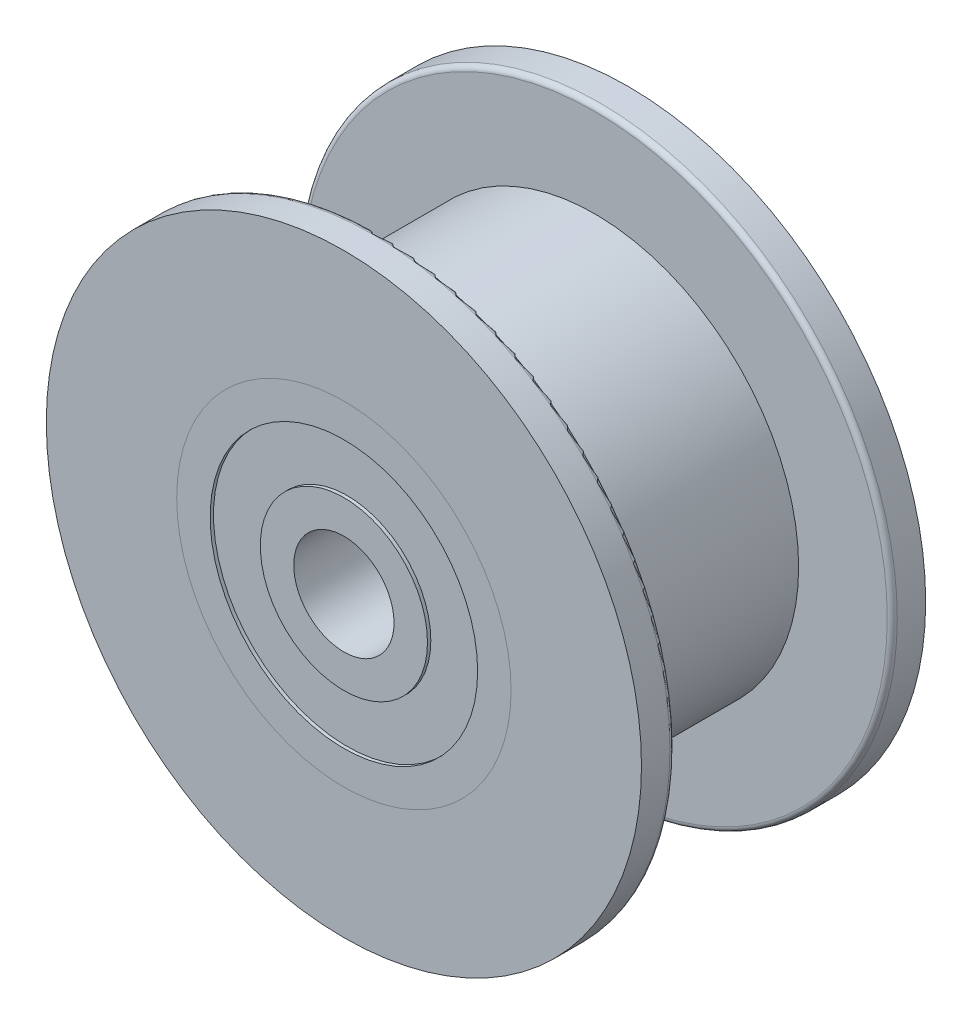
ISO-10303-21;
HEADER;
FILE_DESCRIPTION(('STEP AP214'),'2;1');
FILE_NAME('part.step','',(''),(''),'','','');
FILE_SCHEMA(('AUTOMOTIVE_DESIGN { 1 0 10303 214 1 1 1 1 }'));
ENDSEC;
DATA;
#1=APPLICATION_CONTEXT('core data for automotive mechanical design processes');
#2=APPLICATION_PROTOCOL_DEFINITION('international standard','automotive_design',2000,#1);
#3=PRODUCT_CONTEXT('',#1,'mechanical');
#4=PRODUCT('Part','Part','',(#3));
#5=PRODUCT_RELATED_PRODUCT_CATEGORY('part','',(#4));
#6=PRODUCT_DEFINITION_FORMATION('','',#4);
#7=PRODUCT_DEFINITION_CONTEXT('part definition',#1,'design');
#8=PRODUCT_DEFINITION('design','',#6,#7);
#9=PRODUCT_DEFINITION_SHAPE('','',#8);
#10=(LENGTH_UNIT() NAMED_UNIT(*) SI_UNIT(.MILLI.,.METRE.));
#11=(NAMED_UNIT(*) PLANE_ANGLE_UNIT() SI_UNIT($,.RADIAN.));
#12=(NAMED_UNIT(*) SI_UNIT($,.STERADIAN.) SOLID_ANGLE_UNIT());
#13=UNCERTAINTY_MEASURE_WITH_UNIT(LENGTH_MEASURE(1.E-05),#10,'distance_accuracy_value','');
#14=(GEOMETRIC_REPRESENTATION_CONTEXT(3) GLOBAL_UNCERTAINTY_ASSIGNED_CONTEXT((#13)) GLOBAL_UNIT_ASSIGNED_CONTEXT((#10,
#11,#12)) REPRESENTATION_CONTEXT('',''));
#15=CARTESIAN_POINT('',(0.,0.,0.));
#16=DIRECTION('',(0.,0.,1.));
#17=DIRECTION('',(1.,0.,0.));
#18=AXIS2_PLACEMENT_3D('',#15,#16,#17);
#19=CARTESIAN_POINT('',(0.,0.,4.2));
#20=DIRECTION('',(0.,0.,1.));
#21=DIRECTION('',(1.,0.,0.));
#22=AXIS2_PLACEMENT_3D('',#19,#20,#21);
#23=PLANE('',#22);
#24=CARTESIAN_POINT('',(0.,0.,4.2));
#25=DIRECTION('',(0.,0.,1.));
#26=DIRECTION('',(1.,0.,0.));
#27=AXIS2_PLACEMENT_3D('',#24,#25,#26);
#28=CIRCLE('',#27,2.5);
#29=CARTESIAN_POINT('',(2.5,0.,4.2));
#30=VERTEX_POINT('',#29);
#31=EDGE_CURVE('P0_E27',#30,#30,#28,.T.);
#32=ORIENTED_EDGE('',*,*,#31,.T.);
#33=EDGE_LOOP('',(#32));
#34=FACE_BOUND('',#33,.T.);
#35=CARTESIAN_POINT('',(0.,0.,4.2));
#36=DIRECTION('',(0.,0.,1.));
#37=DIRECTION('',(1.,0.,0.));
#38=AXIS2_PLACEMENT_3D('',#35,#36,#37);
#39=CIRCLE('',#38,4.);
#40=CARTESIAN_POINT('',(4.,0.,4.2));
#41=VERTEX_POINT('',#40);
#42=EDGE_CURVE('P0_E18',#41,#41,#39,.T.);
#43=ORIENTED_EDGE('',*,*,#42,.F.);
#44=EDGE_LOOP('',(#43));
#45=FACE_BOUND('',#44,.T.);
#46=ADVANCED_FACE('P0_F15',(#34,#45),#23,.F.);
#47=CARTESIAN_POINT('',(0.,0.,4.2));
#48=DIRECTION('',(0.,0.,1.));
#49=DIRECTION('',(1.,0.,0.));
#50=AXIS2_PLACEMENT_3D('',#47,#48,#49);
#51=CYLINDRICAL_SURFACE('',#50,4.);
#52=ORIENTED_EDGE('',*,*,#42,.T.);
#53=EDGE_LOOP('',(#52));
#54=FACE_BOUND('',#53,.T.);
#55=CARTESIAN_POINT('',(0.,0.,4.4));
#56=DIRECTION('',(0.,0.,1.));
#57=DIRECTION('',(1.,0.,0.));
#58=AXIS2_PLACEMENT_3D('',#55,#56,#57);
#59=CIRCLE('',#58,4.);
#60=CARTESIAN_POINT('',(4.,0.,4.4));
#61=VERTEX_POINT('',#60);
#62=EDGE_CURVE('P0_E22',#61,#61,#59,.T.);
#63=ORIENTED_EDGE('',*,*,#62,.F.);
#64=EDGE_LOOP('',(#63));
#65=FACE_BOUND('',#64,.T.);
#66=ADVANCED_FACE('P0_F35',(#54,#65),#51,.T.);
#67=CARTESIAN_POINT('',(0.,0.,4.2));
#68=DIRECTION('',(0.,0.,1.));
#69=DIRECTION('',(1.,0.,0.));
#70=AXIS2_PLACEMENT_3D('',#67,#68,#69);
#71=CYLINDRICAL_SURFACE('',#70,2.5);
#72=ORIENTED_EDGE('',*,*,#31,.F.);
#73=EDGE_LOOP('',(#72));
#74=FACE_BOUND('',#73,.T.);
#75=CARTESIAN_POINT('',(0.,0.,4.4));
#76=DIRECTION('',(0.,0.,1.));
#77=DIRECTION('',(1.,0.,0.));
#78=AXIS2_PLACEMENT_3D('',#75,#76,#77);
#79=CIRCLE('',#78,2.5);
#80=CARTESIAN_POINT('',(2.5,0.,4.4));
#81=VERTEX_POINT('',#80);
#82=EDGE_CURVE('P0_E10',#81,#81,#79,.F.);
#83=ORIENTED_EDGE('',*,*,#82,.F.);
#84=EDGE_LOOP('',(#83));
#85=FACE_BOUND('',#84,.T.);
#86=ADVANCED_FACE('P0_F43',(#74,#85),#71,.F.);
#87=CARTESIAN_POINT('',(0.,0.,4.4));
#88=DIRECTION('',(0.,0.,1.));
#89=DIRECTION('',(1.,0.,0.));
#90=AXIS2_PLACEMENT_3D('',#87,#88,#89);
#91=PLANE('',#90);
#92=ORIENTED_EDGE('',*,*,#82,.T.);
#93=EDGE_LOOP('',(#92));
#94=FACE_BOUND('',#93,.T.);
#95=ORIENTED_EDGE('',*,*,#62,.T.);
#96=EDGE_LOOP('',(#95));
#97=FACE_BOUND('',#96,.T.);
#98=ADVANCED_FACE('P0_F44',(#94,#97),#91,.T.);
#99=CLOSED_SHELL('',(#46,#66,#86,#98));
#100=MANIFOLD_SOLID_BREP('P0_B1',#99);
#101=CARTESIAN_POINT('',(0.,0.,0.25));
#102=DIRECTION('',(0.,0.,1.));
#103=DIRECTION('',(1.,0.,0.));
#104=AXIS2_PLACEMENT_3D('',#101,#102,#103);
#105=CYLINDRICAL_SURFACE('',#104,6.1);
#106=CARTESIAN_POINT('',(0.,0.,-3.));
#107=DIRECTION('',(0.,0.,1.));
#108=DIRECTION('',(1.,0.,0.));
#109=AXIS2_PLACEMENT_3D('',#106,#107,#108);
#110=CIRCLE('',#109,6.1);
#111=CARTESIAN_POINT('',(6.1,0.,-3.));
#112=VERTEX_POINT('',#111);
#113=EDGE_CURVE('P1_E18',#112,#112,#110,.F.);
#114=ORIENTED_EDGE('',*,*,#113,.F.);
#115=EDGE_LOOP('',(#114));
#116=FACE_BOUND('',#115,.T.);
#117=CARTESIAN_POINT('',(0.,0.,3.5));
#118=DIRECTION('',(0.,0.,1.));
#119=DIRECTION('',(1.,0.,0.));
#120=AXIS2_PLACEMENT_3D('',#117,#118,#119);
#121=CIRCLE('',#120,6.1);
#122=CARTESIAN_POINT('',(6.1,0.,3.5));
#123=VERTEX_POINT('',#122);
#124=EDGE_CURVE('P1_E40',#123,#123,#121,.T.);
#125=ORIENTED_EDGE('',*,*,#124,.F.);
#126=EDGE_LOOP('',(#125));
#127=FACE_BOUND('',#126,.T.);
#128=ADVANCED_FACE('P1_F15',(#116,#127),#105,.T.);
#129=CARTESIAN_POINT('',(0.,0.,-3.));
#130=DIRECTION('',(0.,0.,1.));
#131=DIRECTION('',(1.,0.,0.));
#132=AXIS2_PLACEMENT_3D('',#129,#130,#131);
#133=PLANE('',#132);
#134=ORIENTED_EDGE('',*,*,#113,.T.);
#135=EDGE_LOOP('',(#134));
#136=FACE_BOUND('',#135,.T.);
#137=CARTESIAN_POINT('',(0.,0.,-3.));
#138=DIRECTION('',(0.,0.,-1.));
#139=DIRECTION('',(-1.,0.,0.));
#140=AXIS2_PLACEMENT_3D('',#137,#138,#139);
#141=CIRCLE('',#140,8.75);
#142=CARTESIAN_POINT('',(-8.75,0.,-3.));
#143=VERTEX_POINT('',#142);
#144=EDGE_CURVE('P1_E42',#143,#143,#141,.T.);
#145=ORIENTED_EDGE('',*,*,#144,.F.);
#146=EDGE_LOOP('',(#145));
#147=FACE_BOUND('',#146,.T.);
#148=ADVANCED_FACE('P1_F50',(#136,#147),#133,.T.);
#149=CARTESIAN_POINT('',(0.,0.,3.5));
#150=DIRECTION('',(0.,0.,-1.));
#151=DIRECTION('',(-1.,0.,0.));
#152=AXIS2_PLACEMENT_3D('',#149,#150,#151);
#153=PLANE('',#152);
#154=ORIENTED_EDGE('',*,*,#124,.T.);
#155=EDGE_LOOP('',(#154));
#156=FACE_BOUND('',#155,.T.);
#157=CARTESIAN_POINT('',(0.,0.,3.5));
#158=DIRECTION('',(0.,0.,1.));
#159=DIRECTION('',(1.,0.,0.));
#160=AXIS2_PLACEMENT_3D('',#157,#158,#159);
#161=CIRCLE('',#160,8.75);
#162=CARTESIAN_POINT('',(8.75,0.,3.5));
#163=VERTEX_POINT('',#162);
#164=EDGE_CURVE('P1_E46',#163,#163,#161,.T.);
#165=ORIENTED_EDGE('',*,*,#164,.F.);
#166=EDGE_LOOP('',(#165));
#167=FACE_BOUND('',#166,.T.);
#168=ADVANCED_FACE('P1_F59',(#156,#167),#153,.T.);
#169=CARTESIAN_POINT('',(0.,0.,-3.15));
#170=DIRECTION('',(0.,0.,1.));
#171=DIRECTION('',(1.,0.,0.));
#172=AXIS2_PLACEMENT_3D('',#169,#170,#171);
#173=TOROIDAL_SURFACE('',#172,8.75,0.15);
#174=CARTESIAN_POINT('',(0.,0.,-3.15));
#175=DIRECTION('',(0.,0.,1.));
#176=DIRECTION('',(1.,0.,0.));
#177=AXIS2_PLACEMENT_3D('',#174,#175,#176);
#178=CIRCLE('',#177,8.9);
#179=CARTESIAN_POINT('',(8.9,0.,-3.15));
#180=VERTEX_POINT('',#179);
#181=EDGE_CURVE('P1_E96',#180,#180,#178,.F.);
#182=ORIENTED_EDGE('',*,*,#181,.F.);
#183=EDGE_LOOP('',(#182));
#184=FACE_BOUND('',#183,.T.);
#185=ORIENTED_EDGE('',*,*,#144,.T.);
#186=EDGE_LOOP('',(#185));
#187=FACE_BOUND('',#186,.T.);
#188=ADVANCED_FACE('P1_F88',(#184,#187),#173,.T.);
#189=CARTESIAN_POINT('',(0.,0.,3.65));
#190=DIRECTION('',(0.,0.,-1.));
#191=DIRECTION('',(-1.,0.,0.));
#192=AXIS2_PLACEMENT_3D('',#189,#190,#191);
#193=TOROIDAL_SURFACE('',#192,8.75,0.15);
#194=CARTESIAN_POINT('',(0.,0.,3.65));
#195=DIRECTION('',(0.,0.,1.));
#196=DIRECTION('',(1.,0.,0.));
#197=AXIS2_PLACEMENT_3D('',#194,#195,#196);
#198=CIRCLE('',#197,8.9);
#199=CARTESIAN_POINT('',(8.9,0.,3.65));
#200=VERTEX_POINT('',#199);
#201=EDGE_CURVE('P1_E39',#200,#200,#198,.T.);
#202=ORIENTED_EDGE('',*,*,#201,.F.);
#203=EDGE_LOOP('',(#202));
#204=FACE_BOUND('',#203,.T.);
#205=ORIENTED_EDGE('',*,*,#164,.T.);
#206=EDGE_LOOP('',(#205));
#207=FACE_BOUND('',#206,.T.);
#208=ADVANCED_FACE('P1_F83',(#204,#207),#193,.T.);
#209=CARTESIAN_POINT('',(0.,0.,-3.5));
#210=DIRECTION('',(0.,0.,1.));
#211=DIRECTION('',(1.,0.,0.));
#212=AXIS2_PLACEMENT_3D('',#209,#210,#211);
#213=CYLINDRICAL_SURFACE('',#212,8.9);
#214=CARTESIAN_POINT('',(0.,0.,-4.));
#215=DIRECTION('',(0.,0.,1.));
#216=DIRECTION('',(1.,0.,0.));
#217=AXIS2_PLACEMENT_3D('',#214,#215,#216);
#218=CIRCLE('',#217,8.9);
#219=CARTESIAN_POINT('',(8.9,0.,-4.));
#220=VERTEX_POINT('',#219);
#221=EDGE_CURVE('P1_E37',#220,#220,#218,.F.);
#222=ORIENTED_EDGE('',*,*,#221,.F.);
#223=EDGE_LOOP('',(#222));
#224=FACE_BOUND('',#223,.T.);
#225=ORIENTED_EDGE('',*,*,#181,.T.);
#226=EDGE_LOOP('',(#225));
#227=FACE_BOUND('',#226,.T.);
#228=ADVANCED_FACE('P1_F79',(#224,#227),#213,.T.);
#229=CARTESIAN_POINT('',(0.,0.,4.));
#230=DIRECTION('',(0.,0.,1.));
#231=DIRECTION('',(1.,0.,0.));
#232=AXIS2_PLACEMENT_3D('',#229,#230,#231);
#233=CYLINDRICAL_SURFACE('',#232,8.9);
#234=ORIENTED_EDGE('',*,*,#201,.T.);
#235=EDGE_LOOP('',(#234));
#236=FACE_BOUND('',#235,.T.);
#237=CARTESIAN_POINT('',(0.,0.,4.5));
#238=DIRECTION('',(0.,0.,1.));
#239=DIRECTION('',(1.,0.,0.));
#240=AXIS2_PLACEMENT_3D('',#237,#238,#239);
#241=CIRCLE('',#240,8.9);
#242=CARTESIAN_POINT('',(8.9,0.,4.5));
#243=VERTEX_POINT('',#242);
#244=EDGE_CURVE('P1_E27',#243,#243,#241,.T.);
#245=ORIENTED_EDGE('',*,*,#244,.F.);
#246=EDGE_LOOP('',(#245));
#247=FACE_BOUND('',#246,.T.);
#248=ADVANCED_FACE('P1_F75',(#236,#247),#233,.T.);
#249=CARTESIAN_POINT('',(0.,0.,-4.));
#250=DIRECTION('',(0.,0.,-1.));
#251=DIRECTION('',(-1.,0.,0.));
#252=AXIS2_PLACEMENT_3D('',#249,#250,#251);
#253=PLANE('',#252);
#254=CARTESIAN_POINT('',(0.,0.,-4.));
#255=DIRECTION('',(0.,0.,-1.));
#256=DIRECTION('',(-1.,0.,0.));
#257=AXIS2_PLACEMENT_3D('',#254,#255,#256);
#258=CIRCLE('',#257,5.);
#259=CARTESIAN_POINT('',(-5.,0.,-4.));
#260=VERTEX_POINT('',#259);
#261=EDGE_CURVE('P1_E22',#260,#260,#258,.F.);
#262=ORIENTED_EDGE('',*,*,#261,.T.);
#263=EDGE_LOOP('',(#262));
#264=FACE_BOUND('',#263,.T.);
#265=ORIENTED_EDGE('',*,*,#221,.T.);
#266=EDGE_LOOP('',(#265));
#267=FACE_BOUND('',#266,.T.);
#268=ADVANCED_FACE('P1_F68',(#264,#267),#253,.T.);
#269=CARTESIAN_POINT('',(0.,0.,4.5));
#270=DIRECTION('',(0.,0.,1.));
#271=DIRECTION('',(1.,0.,0.));
#272=AXIS2_PLACEMENT_3D('',#269,#270,#271);
#273=PLANE('',#272);
#274=CARTESIAN_POINT('',(0.,0.,4.5));
#275=DIRECTION('',(0.,0.,-1.));
#276=DIRECTION('',(-1.,0.,0.));
#277=AXIS2_PLACEMENT_3D('',#274,#275,#276);
#278=CIRCLE('',#277,5.);
#279=CARTESIAN_POINT('',(-5.,0.,4.5));
#280=VERTEX_POINT('',#279);
#281=EDGE_CURVE('P1_E10',#280,#280,#278,.T.);
#282=ORIENTED_EDGE('',*,*,#281,.T.);
#283=EDGE_LOOP('',(#282));
#284=FACE_BOUND('',#283,.T.);
#285=ORIENTED_EDGE('',*,*,#244,.T.);
#286=EDGE_LOOP('',(#285));
#287=FACE_BOUND('',#286,.T.);
#288=ADVANCED_FACE('P1_F62',(#284,#287),#273,.T.);
#289=CARTESIAN_POINT('',(0.,0.,0.25));
#290=DIRECTION('',(0.,0.,-1.));
#291=DIRECTION('',(-1.,0.,0.));
#292=AXIS2_PLACEMENT_3D('',#289,#290,#291);
#293=CYLINDRICAL_SURFACE('',#292,5.);
#294=ORIENTED_EDGE('',*,*,#261,.F.);
#295=EDGE_LOOP('',(#294));
#296=FACE_BOUND('',#295,.T.);
#297=ORIENTED_EDGE('',*,*,#281,.F.);
#298=EDGE_LOOP('',(#297));
#299=FACE_BOUND('',#298,.T.);
#300=ADVANCED_FACE('P1_F60',(#296,#299),#293,.F.);
#301=CLOSED_SHELL('',(#128,#148,#168,#188,#208,#228,#248,#268,#288,#300));
#302=MANIFOLD_SOLID_BREP('P1_B1',#301);
#303=CARTESIAN_POINT('',(0.,0.,3.25));
#304=DIRECTION('',(0.,0.,1.));
#305=DIRECTION('',(1.,0.,0.));
#306=AXIS2_PLACEMENT_3D('',#303,#304,#305);
#307=CYLINDRICAL_SURFACE('',#306,4.);
#308=CARTESIAN_POINT('',(0.,0.,2.));
#309=DIRECTION('',(0.,0.,1.));
#310=DIRECTION('',(1.,0.,0.));
#311=AXIS2_PLACEMENT_3D('',#308,#309,#310);
#312=CIRCLE('',#311,4.);
#313=CARTESIAN_POINT('',(4.,0.,2.));
#314=VERTEX_POINT('',#313);
#315=EDGE_CURVE('P2_E27',#314,#314,#312,.T.);
#316=ORIENTED_EDGE('',*,*,#315,.F.);
#317=EDGE_LOOP('',(#316));
#318=FACE_BOUND('',#317,.T.);
#319=CARTESIAN_POINT('',(0.,0.,4.5));
#320=DIRECTION('',(0.,0.,1.));
#321=DIRECTION('',(1.,0.,0.));
#322=AXIS2_PLACEMENT_3D('',#319,#320,#321);
#323=CIRCLE('',#322,4.);
#324=CARTESIAN_POINT('',(4.,0.,4.5));
#325=VERTEX_POINT('',#324);
#326=EDGE_CURVE('P2_E18',#325,#325,#323,.F.);
#327=ORIENTED_EDGE('',*,*,#326,.F.);
#328=EDGE_LOOP('',(#327));
#329=FACE_BOUND('',#328,.T.);
#330=ADVANCED_FACE('P2_F15',(#318,#329),#307,.F.);
#331=CARTESIAN_POINT('',(4.,0.,4.5));
#332=DIRECTION('',(0.,0.,1.));
#333=DIRECTION('',(1.,0.,0.));
#334=AXIS2_PLACEMENT_3D('',#331,#332,#333);
#335=PLANE('',#334);
#336=ORIENTED_EDGE('',*,*,#326,.T.);
#337=EDGE_LOOP('',(#336));
#338=FACE_BOUND('',#337,.T.);
#339=CARTESIAN_POINT('',(0.,0.,4.5));
#340=DIRECTION('',(0.,0.,1.));
#341=DIRECTION('',(1.,0.,0.));
#342=AXIS2_PLACEMENT_3D('',#339,#340,#341);
#343=CIRCLE('',#342,5.);
#344=CARTESIAN_POINT('',(5.,0.,4.5));
#345=VERTEX_POINT('',#344);
#346=EDGE_CURVE('P2_E22',#345,#345,#343,.F.);
#347=ORIENTED_EDGE('',*,*,#346,.F.);
#348=EDGE_LOOP('',(#347));
#349=FACE_BOUND('',#348,.T.);
#350=ADVANCED_FACE('P2_F35',(#338,#349),#335,.T.);
#351=CARTESIAN_POINT('',(5.,0.,2.));
#352=DIRECTION('',(0.,0.,-1.));
#353=DIRECTION('',(-1.,0.,0.));
#354=AXIS2_PLACEMENT_3D('',#351,#352,#353);
#355=PLANE('',#354);
#356=ORIENTED_EDGE('',*,*,#315,.T.);
#357=EDGE_LOOP('',(#356));
#358=FACE_BOUND('',#357,.T.);
#359=CARTESIAN_POINT('',(0.,0.,2.));
#360=DIRECTION('',(0.,0.,1.));
#361=DIRECTION('',(1.,0.,0.));
#362=AXIS2_PLACEMENT_3D('',#359,#360,#361);
#363=CIRCLE('',#362,5.);
#364=CARTESIAN_POINT('',(5.,0.,2.));
#365=VERTEX_POINT('',#364);
#366=EDGE_CURVE('P2_E10',#365,#365,#363,.T.);
#367=ORIENTED_EDGE('',*,*,#366,.F.);
#368=EDGE_LOOP('',(#367));
#369=FACE_BOUND('',#368,.T.);
#370=ADVANCED_FACE('P2_F44',(#358,#369),#355,.T.);
#371=CARTESIAN_POINT('',(0.,0.,3.25));
#372=DIRECTION('',(0.,0.,1.));
#373=DIRECTION('',(1.,0.,0.));
#374=AXIS2_PLACEMENT_3D('',#371,#372,#373);
#375=CYLINDRICAL_SURFACE('',#374,5.);
#376=ORIENTED_EDGE('',*,*,#366,.T.);
#377=EDGE_LOOP('',(#376));
#378=FACE_BOUND('',#377,.T.);
#379=ORIENTED_EDGE('',*,*,#346,.T.);
#380=EDGE_LOOP('',(#379));
#381=FACE_BOUND('',#380,.T.);
#382=ADVANCED_FACE('P2_F45',(#378,#381),#375,.T.);
#383=CLOSED_SHELL('',(#330,#350,#370,#382));
#384=MANIFOLD_SOLID_BREP('P2_B1',#383);
#385=CARTESIAN_POINT('',(0.,0.,3.25));
#386=DIRECTION('',(0.,0.,1.));
#387=DIRECTION('',(1.,0.,0.));
#388=AXIS2_PLACEMENT_3D('',#385,#386,#387);
#389=CYLINDRICAL_SURFACE('',#388,1.5);
#390=CARTESIAN_POINT('',(0.,0.,2.));
#391=DIRECTION('',(0.,0.,1.));
#392=DIRECTION('',(1.,0.,0.));
#393=AXIS2_PLACEMENT_3D('',#390,#391,#392);
#394=CIRCLE('',#393,1.5);
#395=CARTESIAN_POINT('',(1.5,0.,2.));
#396=VERTEX_POINT('',#395);
#397=EDGE_CURVE('P3_E27',#396,#396,#394,.T.);
#398=ORIENTED_EDGE('',*,*,#397,.F.);
#399=EDGE_LOOP('',(#398));
#400=FACE_BOUND('',#399,.T.);
#401=CARTESIAN_POINT('',(0.,0.,4.5));
#402=DIRECTION('',(0.,0.,1.));
#403=DIRECTION('',(1.,0.,0.));
#404=AXIS2_PLACEMENT_3D('',#401,#402,#403);
#405=CIRCLE('',#404,1.5);
#406=CARTESIAN_POINT('',(1.5,0.,4.5));
#407=VERTEX_POINT('',#406);
#408=EDGE_CURVE('P3_E18',#407,#407,#405,.F.);
#409=ORIENTED_EDGE('',*,*,#408,.F.);
#410=EDGE_LOOP('',(#409));
#411=FACE_BOUND('',#410,.T.);
#412=ADVANCED_FACE('P3_F15',(#400,#411),#389,.F.);
#413=CARTESIAN_POINT('',(1.5,0.,4.5));
#414=DIRECTION('',(0.,0.,1.));
#415=DIRECTION('',(1.,0.,0.));
#416=AXIS2_PLACEMENT_3D('',#413,#414,#415);
#417=PLANE('',#416);
#418=ORIENTED_EDGE('',*,*,#408,.T.);
#419=EDGE_LOOP('',(#418));
#420=FACE_BOUND('',#419,.T.);
#421=CARTESIAN_POINT('',(0.,0.,4.5));
#422=DIRECTION('',(0.,0.,1.));
#423=DIRECTION('',(1.,0.,0.));
#424=AXIS2_PLACEMENT_3D('',#421,#422,#423);
#425=CIRCLE('',#424,2.5);
#426=CARTESIAN_POINT('',(2.5,0.,4.5));
#427=VERTEX_POINT('',#426);
#428=EDGE_CURVE('P3_E22',#427,#427,#425,.F.);
#429=ORIENTED_EDGE('',*,*,#428,.F.);
#430=EDGE_LOOP('',(#429));
#431=FACE_BOUND('',#430,.T.);
#432=ADVANCED_FACE('P3_F35',(#420,#431),#417,.T.);
#433=CARTESIAN_POINT('',(2.5,0.,2.));
#434=DIRECTION('',(0.,0.,-1.));
#435=DIRECTION('',(-1.,0.,0.));
#436=AXIS2_PLACEMENT_3D('',#433,#434,#435);
#437=PLANE('',#436);
#438=ORIENTED_EDGE('',*,*,#397,.T.);
#439=EDGE_LOOP('',(#438));
#440=FACE_BOUND('',#439,.T.);
#441=CARTESIAN_POINT('',(0.,0.,2.));
#442=DIRECTION('',(0.,0.,1.));
#443=DIRECTION('',(1.,0.,0.));
#444=AXIS2_PLACEMENT_3D('',#441,#442,#443);
#445=CIRCLE('',#444,2.5);
#446=CARTESIAN_POINT('',(2.5,0.,2.));
#447=VERTEX_POINT('',#446);
#448=EDGE_CURVE('P3_E10',#447,#447,#445,.T.);
#449=ORIENTED_EDGE('',*,*,#448,.F.);
#450=EDGE_LOOP('',(#449));
#451=FACE_BOUND('',#450,.T.);
#452=ADVANCED_FACE('P3_F44',(#440,#451),#437,.T.);
#453=CARTESIAN_POINT('',(0.,0.,3.25));
#454=DIRECTION('',(0.,0.,1.));
#455=DIRECTION('',(1.,0.,0.));
#456=AXIS2_PLACEMENT_3D('',#453,#454,#455);
#457=CYLINDRICAL_SURFACE('',#456,2.5);
#458=ORIENTED_EDGE('',*,*,#448,.T.);
#459=EDGE_LOOP('',(#458));
#460=FACE_BOUND('',#459,.T.);
#461=ORIENTED_EDGE('',*,*,#428,.T.);
#462=EDGE_LOOP('',(#461));
#463=FACE_BOUND('',#462,.T.);
#464=ADVANCED_FACE('P3_F45',(#460,#463),#457,.T.);
#465=CLOSED_SHELL('',(#412,#432,#452,#464));
#466=MANIFOLD_SOLID_BREP('P3_B1',#465);
#467=ADVANCED_BREP_SHAPE_REPRESENTATION('',(#18,#100,#302,#384,#466),#14);
#468=SHAPE_DEFINITION_REPRESENTATION(#9,#467);
ENDSEC;
END-ISO-10303-21;
